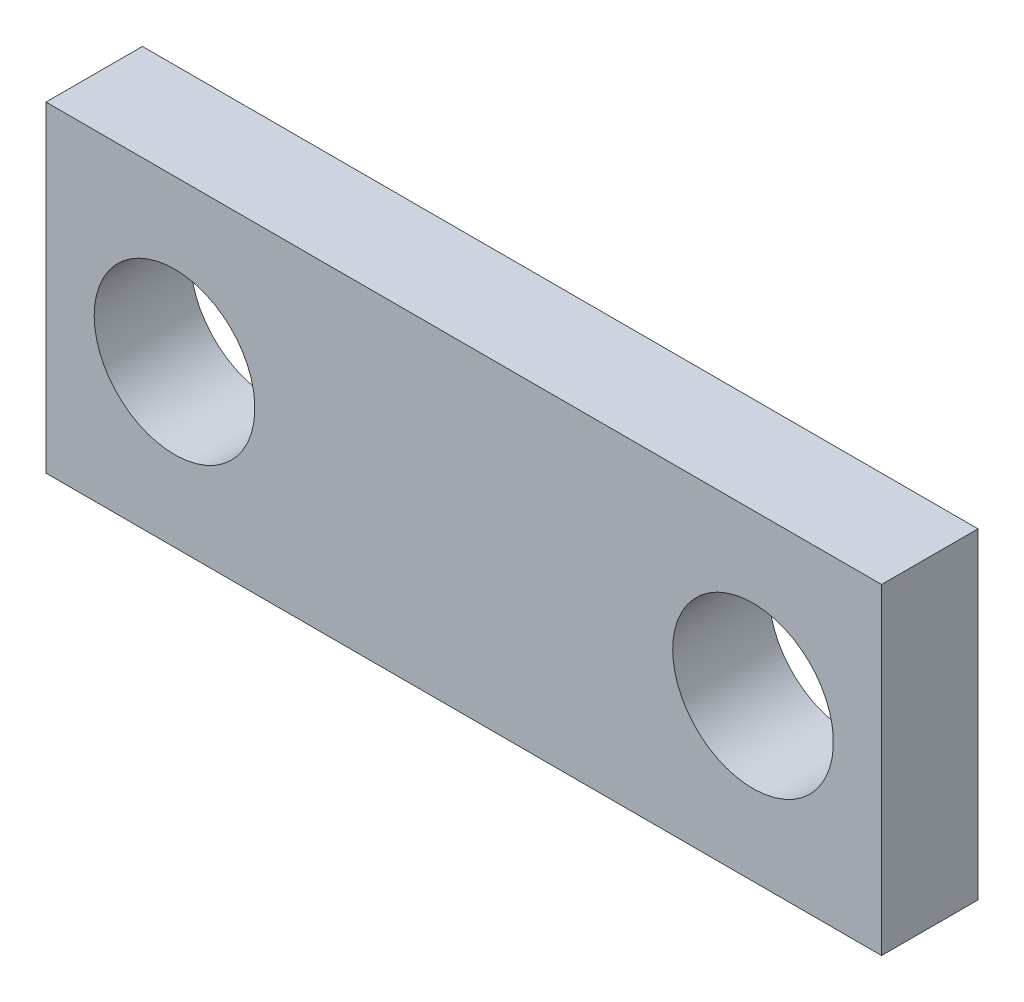
ISO-10303-21;
HEADER;
FILE_DESCRIPTION(('STEP AP214'),'2;1');
FILE_NAME('part.step','',(''),(''),'','','');
FILE_SCHEMA(('AUTOMOTIVE_DESIGN { 1 0 10303 214 1 1 1 1 }'));
ENDSEC;
DATA;
#1=APPLICATION_CONTEXT('core data for automotive mechanical design processes');
#2=APPLICATION_PROTOCOL_DEFINITION('international standard','automotive_design',2000,#1);
#3=PRODUCT_CONTEXT('',#1,'mechanical');
#4=PRODUCT('Part','Part','',(#3));
#5=PRODUCT_RELATED_PRODUCT_CATEGORY('part','',(#4));
#6=PRODUCT_DEFINITION_FORMATION('','',#4);
#7=PRODUCT_DEFINITION_CONTEXT('part definition',#1,'design');
#8=PRODUCT_DEFINITION('design','',#6,#7);
#9=PRODUCT_DEFINITION_SHAPE('','',#8);
#10=(LENGTH_UNIT() NAMED_UNIT(*) SI_UNIT(.MILLI.,.METRE.));
#11=(NAMED_UNIT(*) PLANE_ANGLE_UNIT() SI_UNIT($,.RADIAN.));
#12=(NAMED_UNIT(*) SI_UNIT($,.STERADIAN.) SOLID_ANGLE_UNIT());
#13=UNCERTAINTY_MEASURE_WITH_UNIT(LENGTH_MEASURE(1.E-05),#10,'distance_accuracy_value','');
#14=(GEOMETRIC_REPRESENTATION_CONTEXT(3) GLOBAL_UNCERTAINTY_ASSIGNED_CONTEXT((#13)) GLOBAL_UNIT_ASSIGNED_CONTEXT((#10,
#11,#12)) REPRESENTATION_CONTEXT('',''));
#15=CARTESIAN_POINT('',(0.,0.,0.));
#16=DIRECTION('',(0.,0.,1.));
#17=DIRECTION('',(1.,0.,0.));
#18=AXIS2_PLACEMENT_3D('',#15,#16,#17);
#19=CARTESIAN_POINT('',(-13.,5.,0.));
#20=DIRECTION('',(-1.,0.,0.));
#21=DIRECTION('',(0.,0.,1.));
#22=AXIS2_PLACEMENT_3D('',#19,#20,#21);
#23=PLANE('',#22);
#24=DIRECTION('',(0.,-1.,0.));
#25=VECTOR('',#24,1.);
#26=CARTESIAN_POINT('',(-13.,5.,3.));
#27=LINE('',#26,#25);
#28=CARTESIAN_POINT('',(-13.,5.,3.));
#29=VERTEX_POINT('',#28);
#30=CARTESIAN_POINT('',(-13.,-5.,3.));
#31=VERTEX_POINT('',#30);
#32=EDGE_CURVE('E98',#29,#31,#27,.T.);
#33=ORIENTED_EDGE('',*,*,#32,.F.);
#34=DIRECTION('',(0.,0.,1.));
#35=VECTOR('',#34,1.);
#36=CARTESIAN_POINT('',(-13.,5.,0.));
#37=LINE('',#36,#35);
#38=CARTESIAN_POINT('',(-13.,5.,0.));
#39=VERTEX_POINT('',#38);
#40=EDGE_CURVE('E11',#39,#29,#37,.T.);
#41=ORIENTED_EDGE('',*,*,#40,.F.);
#42=DIRECTION('',(0.,-1.,0.));
#43=VECTOR('',#42,1.);
#44=CARTESIAN_POINT('',(-13.,5.,0.));
#45=LINE('',#44,#43);
#46=CARTESIAN_POINT('',(-13.,-5.,0.));
#47=VERTEX_POINT('',#46);
#48=EDGE_CURVE('E91',#39,#47,#45,.T.);
#49=ORIENTED_EDGE('',*,*,#48,.T.);
#50=DIRECTION('',(0.,0.,1.));
#51=VECTOR('',#50,1.);
#52=CARTESIAN_POINT('',(-13.,-5.,0.));
#53=LINE('',#52,#51);
#54=EDGE_CURVE('E36',#47,#31,#53,.T.);
#55=ORIENTED_EDGE('',*,*,#54,.T.);
#56=EDGE_LOOP('',(#33,#41,#49,#55));
#57=FACE_BOUND('',#56,.T.);
#58=ADVANCED_FACE('F33',(#57),#23,.T.);
#59=CARTESIAN_POINT('',(13.,5.,0.));
#60=DIRECTION('',(0.,1.,0.));
#61=DIRECTION('',(0.,0.,1.));
#62=AXIS2_PLACEMENT_3D('',#59,#60,#61);
#63=PLANE('',#62);
#64=DIRECTION('',(-1.,0.,0.));
#65=VECTOR('',#64,1.);
#66=CARTESIAN_POINT('',(13.,5.,3.));
#67=LINE('',#66,#65);
#68=CARTESIAN_POINT('',(13.,5.,3.));
#69=VERTEX_POINT('',#68);
#70=EDGE_CURVE('E93',#69,#29,#67,.T.);
#71=ORIENTED_EDGE('',*,*,#70,.F.);
#72=DIRECTION('',(0.,0.,1.));
#73=VECTOR('',#72,1.);
#74=CARTESIAN_POINT('',(13.,5.,0.));
#75=LINE('',#74,#73);
#76=CARTESIAN_POINT('',(13.,5.,0.));
#77=VERTEX_POINT('',#76);
#78=EDGE_CURVE('E42',#77,#69,#75,.T.);
#79=ORIENTED_EDGE('',*,*,#78,.F.);
#80=DIRECTION('',(-1.,0.,0.));
#81=VECTOR('',#80,1.);
#82=CARTESIAN_POINT('',(13.,5.,0.));
#83=LINE('',#82,#81);
#84=EDGE_CURVE('E88',#77,#39,#83,.T.);
#85=ORIENTED_EDGE('',*,*,#84,.T.);
#86=ORIENTED_EDGE('',*,*,#40,.T.);
#87=EDGE_LOOP('',(#71,#79,#85,#86));
#88=FACE_BOUND('',#87,.T.);
#89=ADVANCED_FACE('F109',(#88),#63,.T.);
#90=CARTESIAN_POINT('',(13.,-5.,0.));
#91=DIRECTION('',(1.,0.,0.));
#92=DIRECTION('',(0.,0.,-1.));
#93=AXIS2_PLACEMENT_3D('',#90,#91,#92);
#94=PLANE('',#93);
#95=DIRECTION('',(0.,1.,0.));
#96=VECTOR('',#95,1.);
#97=CARTESIAN_POINT('',(13.,-5.,3.));
#98=LINE('',#97,#96);
#99=CARTESIAN_POINT('',(13.,-5.,3.));
#100=VERTEX_POINT('',#99);
#101=EDGE_CURVE('E83',#100,#69,#98,.T.);
#102=ORIENTED_EDGE('',*,*,#101,.F.);
#103=DIRECTION('',(0.,0.,1.));
#104=VECTOR('',#103,1.);
#105=CARTESIAN_POINT('',(13.,-5.,0.));
#106=LINE('',#105,#104);
#107=CARTESIAN_POINT('',(13.,-5.,0.));
#108=VERTEX_POINT('',#107);
#109=EDGE_CURVE('E78',#108,#100,#106,.T.);
#110=ORIENTED_EDGE('',*,*,#109,.F.);
#111=DIRECTION('',(0.,1.,0.));
#112=VECTOR('',#111,1.);
#113=CARTESIAN_POINT('',(13.,-5.,0.));
#114=LINE('',#113,#112);
#115=EDGE_CURVE('E81',#108,#77,#114,.T.);
#116=ORIENTED_EDGE('',*,*,#115,.T.);
#117=ORIENTED_EDGE('',*,*,#78,.T.);
#118=EDGE_LOOP('',(#102,#110,#116,#117));
#119=FACE_BOUND('',#118,.T.);
#120=ADVANCED_FACE('F80',(#119),#94,.T.);
#121=CARTESIAN_POINT('',(-13.,-5.,0.));
#122=DIRECTION('',(0.,-1.,0.));
#123=DIRECTION('',(0.,0.,-1.));
#124=AXIS2_PLACEMENT_3D('',#121,#122,#123);
#125=PLANE('',#124);
#126=DIRECTION('',(1.,0.,0.));
#127=VECTOR('',#126,1.);
#128=CARTESIAN_POINT('',(-13.,-5.,3.));
#129=LINE('',#128,#127);
#130=EDGE_CURVE('E101',#31,#100,#129,.T.);
#131=ORIENTED_EDGE('',*,*,#130,.F.);
#132=ORIENTED_EDGE('',*,*,#54,.F.);
#133=DIRECTION('',(1.,0.,0.));
#134=VECTOR('',#133,1.);
#135=CARTESIAN_POINT('',(-13.,-5.,0.));
#136=LINE('',#135,#134);
#137=EDGE_CURVE('E87',#47,#108,#136,.T.);
#138=ORIENTED_EDGE('',*,*,#137,.T.);
#139=ORIENTED_EDGE('',*,*,#109,.T.);
#140=EDGE_LOOP('',(#131,#132,#138,#139));
#141=FACE_BOUND('',#140,.T.);
#142=ADVANCED_FACE('F90',(#141),#125,.T.);
#143=CARTESIAN_POINT('',(0.,0.,0.));
#144=DIRECTION('',(0.,0.,1.));
#145=DIRECTION('',(1.,0.,0.));
#146=AXIS2_PLACEMENT_3D('',#143,#144,#145);
#147=PLANE('',#146);
#148=CARTESIAN_POINT('',(-9.,0.,0.));
#149=DIRECTION('',(0.,0.,1.));
#150=DIRECTION('',(-1.,0.,0.));
#151=AXIS2_PLACEMENT_3D('',#148,#149,#150);
#152=CIRCLE('',#151,2.5);
#153=CARTESIAN_POINT('',(-11.5,0.,0.));
#154=VERTEX_POINT('',#153);
#155=EDGE_CURVE('E142',#154,#154,#152,.T.);
#156=ORIENTED_EDGE('',*,*,#155,.T.);
#157=EDGE_LOOP('',(#156));
#158=FACE_BOUND('',#157,.T.);
#159=CARTESIAN_POINT('',(9.,0.,0.));
#160=DIRECTION('',(0.,0.,1.));
#161=DIRECTION('',(-1.,0.,0.));
#162=AXIS2_PLACEMENT_3D('',#159,#160,#161);
#163=CIRCLE('',#162,2.5);
#164=CARTESIAN_POINT('',(6.5,0.,0.));
#165=VERTEX_POINT('',#164);
#166=EDGE_CURVE('E102',#165,#165,#163,.T.);
#167=ORIENTED_EDGE('',*,*,#166,.T.);
#168=EDGE_LOOP('',(#167));
#169=FACE_BOUND('',#168,.T.);
#170=ORIENTED_EDGE('',*,*,#48,.F.);
#171=ORIENTED_EDGE('',*,*,#84,.F.);
#172=ORIENTED_EDGE('',*,*,#115,.F.);
#173=ORIENTED_EDGE('',*,*,#137,.F.);
#174=EDGE_LOOP('',(#170,#171,#172,#173));
#175=FACE_BOUND('',#174,.T.);
#176=ADVANCED_FACE('F86',(#158,#169,#175),#147,.F.);
#177=CARTESIAN_POINT('',(0.,0.,3.));
#178=DIRECTION('',(0.,0.,1.));
#179=DIRECTION('',(1.,0.,0.));
#180=AXIS2_PLACEMENT_3D('',#177,#178,#179);
#181=PLANE('',#180);
#182=CARTESIAN_POINT('',(-9.,0.,3.));
#183=DIRECTION('',(0.,0.,1.));
#184=DIRECTION('',(-1.,0.,0.));
#185=AXIS2_PLACEMENT_3D('',#182,#183,#184);
#186=CIRCLE('',#185,2.5);
#187=CARTESIAN_POINT('',(-11.5,0.,3.));
#188=VERTEX_POINT('',#187);
#189=EDGE_CURVE('E145',#188,#188,#186,.T.);
#190=ORIENTED_EDGE('',*,*,#189,.F.);
#191=EDGE_LOOP('',(#190));
#192=FACE_BOUND('',#191,.T.);
#193=CARTESIAN_POINT('',(9.,0.,3.));
#194=DIRECTION('',(0.,0.,1.));
#195=DIRECTION('',(-1.,0.,0.));
#196=AXIS2_PLACEMENT_3D('',#193,#194,#195);
#197=CIRCLE('',#196,2.5);
#198=CARTESIAN_POINT('',(6.5,0.,3.));
#199=VERTEX_POINT('',#198);
#200=EDGE_CURVE('E147',#199,#199,#197,.T.);
#201=ORIENTED_EDGE('',*,*,#200,.F.);
#202=EDGE_LOOP('',(#201));
#203=FACE_BOUND('',#202,.T.);
#204=ORIENTED_EDGE('',*,*,#32,.T.);
#205=ORIENTED_EDGE('',*,*,#130,.T.);
#206=ORIENTED_EDGE('',*,*,#101,.T.);
#207=ORIENTED_EDGE('',*,*,#70,.T.);
#208=EDGE_LOOP('',(#204,#205,#206,#207));
#209=FACE_BOUND('',#208,.T.);
#210=ADVANCED_FACE('F108',(#192,#203,#209),#181,.T.);
#211=CARTESIAN_POINT('',(9.,0.,0.));
#212=DIRECTION('',(0.,0.,1.));
#213=DIRECTION('',(1.,0.,0.));
#214=AXIS2_PLACEMENT_3D('',#211,#212,#213);
#215=CYLINDRICAL_SURFACE('',#214,2.5);
#216=ORIENTED_EDGE('',*,*,#166,.F.);
#217=EDGE_LOOP('',(#216));
#218=FACE_BOUND('',#217,.T.);
#219=ORIENTED_EDGE('',*,*,#200,.T.);
#220=EDGE_LOOP('',(#219));
#221=FACE_BOUND('',#220,.T.);
#222=ADVANCED_FACE('F127',(#218,#221),#215,.F.);
#223=CARTESIAN_POINT('',(-9.,0.,0.));
#224=DIRECTION('',(0.,0.,1.));
#225=DIRECTION('',(1.,0.,0.));
#226=AXIS2_PLACEMENT_3D('',#223,#224,#225);
#227=CYLINDRICAL_SURFACE('',#226,2.5);
#228=ORIENTED_EDGE('',*,*,#155,.F.);
#229=EDGE_LOOP('',(#228));
#230=FACE_BOUND('',#229,.T.);
#231=ORIENTED_EDGE('',*,*,#189,.T.);
#232=EDGE_LOOP('',(#231));
#233=FACE_BOUND('',#232,.T.);
#234=ADVANCED_FACE('F134',(#230,#233),#227,.F.);
#235=CLOSED_SHELL('',(#58,#89,#120,#142,#176,#210,#222,#234));
#236=MANIFOLD_SOLID_BREP('B2',#235);
#237=ADVANCED_BREP_SHAPE_REPRESENTATION('',(#18,#236),#14);
#238=SHAPE_DEFINITION_REPRESENTATION(#9,#237);
ENDSEC;
END-ISO-10303-21;
